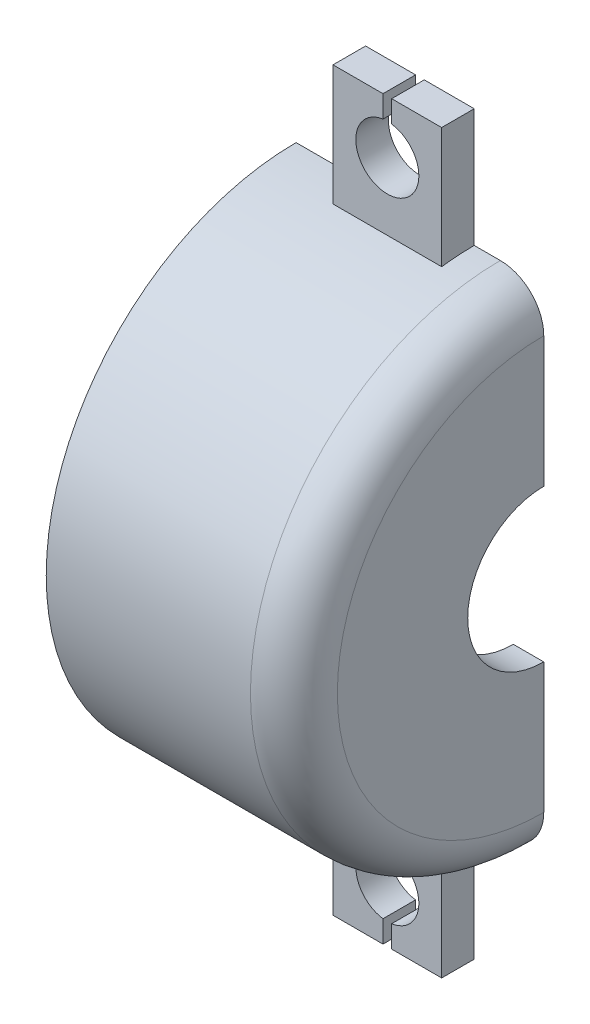
ISO-10303-21;
HEADER;
FILE_DESCRIPTION(('STEP AP214'),'2;1');
FILE_NAME('part.step','',(''),(''),'','','');
FILE_SCHEMA(('AUTOMOTIVE_DESIGN { 1 0 10303 214 1 1 1 1 }'));
ENDSEC;
DATA;
#1=APPLICATION_CONTEXT('core data for automotive mechanical design processes');
#2=APPLICATION_PROTOCOL_DEFINITION('international standard','automotive_design',2000,#1);
#3=PRODUCT_CONTEXT('',#1,'mechanical');
#4=PRODUCT('Part','Part','',(#3));
#5=PRODUCT_RELATED_PRODUCT_CATEGORY('part','',(#4));
#6=PRODUCT_DEFINITION_FORMATION('','',#4);
#7=PRODUCT_DEFINITION_CONTEXT('part definition',#1,'design');
#8=PRODUCT_DEFINITION('design','',#6,#7);
#9=PRODUCT_DEFINITION_SHAPE('','',#8);
#10=(LENGTH_UNIT() NAMED_UNIT(*) SI_UNIT(.MILLI.,.METRE.));
#11=(NAMED_UNIT(*) PLANE_ANGLE_UNIT() SI_UNIT($,.RADIAN.));
#12=(NAMED_UNIT(*) SI_UNIT($,.STERADIAN.) SOLID_ANGLE_UNIT());
#13=UNCERTAINTY_MEASURE_WITH_UNIT(LENGTH_MEASURE(1.E-05),#10,'distance_accuracy_value','');
#14=(GEOMETRIC_REPRESENTATION_CONTEXT(3) GLOBAL_UNCERTAINTY_ASSIGNED_CONTEXT((#13)) GLOBAL_UNIT_ASSIGNED_CONTEXT((#10,
#11,#12)) REPRESENTATION_CONTEXT('',''));
#15=CARTESIAN_POINT('',(0.,0.,0.));
#16=DIRECTION('',(0.,0.,1.));
#17=DIRECTION('',(1.,0.,0.));
#18=AXIS2_PLACEMENT_3D('',#15,#16,#17);
#19=CARTESIAN_POINT('',(-19.1835123598581,2.5,0.));
#20=DIRECTION('',(-1.,0.,0.));
#21=DIRECTION('',(0.,-1.,0.));
#22=AXIS2_PLACEMENT_3D('',#19,#20,#21);
#23=CYLINDRICAL_SURFACE('',#22,3.5);
#24=CARTESIAN_POINT('',(-13.,2.5,0.));
#25=DIRECTION('',(-1.,0.,0.));
#26=DIRECTION('',(0.,-1.,0.));
#27=AXIS2_PLACEMENT_3D('',#24,#25,#26);
#28=CIRCLE('',#27,3.5);
#29=CARTESIAN_POINT('',(-13.,-0.999999999999998,0.));
#30=VERTEX_POINT('',#29);
#31=CARTESIAN_POINT('',(-13.,6.,0.));
#32=VERTEX_POINT('',#31);
#33=EDGE_CURVE('E388',#30,#32,#28,.T.);
#34=ORIENTED_EDGE('',*,*,#33,.T.);
#35=DIRECTION('',(-1.,0.,0.));
#36=VECTOR('',#35,1.);
#37=CARTESIAN_POINT('',(-19.1835123598581,6.,0.));
#38=LINE('',#37,#36);
#39=CARTESIAN_POINT('',(-11.6,6.,0.));
#40=VERTEX_POINT('',#39);
#41=EDGE_CURVE('E385',#32,#40,#38,.F.);
#42=ORIENTED_EDGE('',*,*,#41,.T.);
#43=CARTESIAN_POINT('',(-11.6,2.5,0.));
#44=DIRECTION('',(-1.,0.,0.));
#45=DIRECTION('',(0.,-1.,0.));
#46=AXIS2_PLACEMENT_3D('',#43,#44,#45);
#47=CIRCLE('',#46,3.5);
#48=CARTESIAN_POINT('',(-11.6,-0.999999999999998,0.));
#49=VERTEX_POINT('',#48);
#50=EDGE_CURVE('E412',#49,#40,#47,.T.);
#51=ORIENTED_EDGE('',*,*,#50,.F.);
#52=DIRECTION('',(-1.,0.,0.));
#53=VECTOR('',#52,1.);
#54=CARTESIAN_POINT('',(-19.1835123598581,-0.999999999999998,0.));
#55=LINE('',#54,#53);
#56=EDGE_CURVE('E369',#49,#30,#55,.T.);
#57=ORIENTED_EDGE('',*,*,#56,.T.);
#58=EDGE_LOOP('',(#34,#42,#51,#57));
#59=FACE_BOUND('',#58,.T.);
#60=ADVANCED_FACE('F35',(#59),#23,.F.);
#61=CARTESIAN_POINT('',(-11.6,6.,0.));
#62=DIRECTION('',(-1.,0.,0.));
#63=DIRECTION('',(0.,-1.,0.));
#64=AXIS2_PLACEMENT_3D('',#61,#62,#63);
#65=PLANE('',#64);
#66=DIRECTION('',(0.,1.,0.));
#67=VECTOR('',#66,1.);
#68=CARTESIAN_POINT('',(-11.6,6.,0.));
#69=LINE('',#68,#67);
#70=CARTESIAN_POINT('',(-11.6,12.,0.));
#71=VERTEX_POINT('',#70);
#72=EDGE_CURVE('E370',#40,#71,#69,.T.);
#73=ORIENTED_EDGE('',*,*,#72,.T.);
#74=CARTESIAN_POINT('',(-11.6,2.5,0.));
#75=DIRECTION('',(-1.,0.,0.));
#76=DIRECTION('',(0.,-1.,0.));
#77=AXIS2_PLACEMENT_3D('',#74,#75,#76);
#78=CIRCLE('',#77,9.5);
#79=CARTESIAN_POINT('',(-11.6,-7.,0.));
#80=VERTEX_POINT('',#79);
#81=EDGE_CURVE('E43',#71,#80,#78,.F.);
#82=ORIENTED_EDGE('',*,*,#81,.T.);
#83=EDGE_CURVE('E367',#80,#49,#69,.T.);
#84=ORIENTED_EDGE('',*,*,#83,.T.);
#85=ORIENTED_EDGE('',*,*,#50,.T.);
#86=EDGE_LOOP('',(#73,#82,#84,#85));
#87=FACE_BOUND('',#86,.T.);
#88=ADVANCED_FACE('F498',(#87),#65,.F.);
#89=CARTESIAN_POINT('',(-19.1835123598581,2.5,0.));
#90=DIRECTION('',(-1.,0.,0.));
#91=DIRECTION('',(0.,-1.,0.));
#92=AXIS2_PLACEMENT_3D('',#89,#90,#91);
#93=CYLINDRICAL_SURFACE('',#92,11.5);
#94=DIRECTION('',(-1.,0.,0.));
#95=VECTOR('',#94,1.);
#96=CARTESIAN_POINT('',(-19.1835123598581,-9.,0.));
#97=LINE('',#96,#95);
#98=CARTESIAN_POINT('',(-14.8,-9.,0.));
#99=VERTEX_POINT('',#98);
#100=CARTESIAN_POINT('',(-13.6,-9.,0.));
#101=VERTEX_POINT('',#100);
#102=EDGE_CURVE('E363',#99,#101,#97,.F.);
#103=ORIENTED_EDGE('',*,*,#102,.T.);
#104=CARTESIAN_POINT('',(-13.6,2.5,0.));
#105=DIRECTION('',(-1.,0.,0.));
#106=DIRECTION('',(0.,-1.,0.));
#107=AXIS2_PLACEMENT_3D('',#104,#105,#106);
#108=CIRCLE('',#107,11.5);
#109=CARTESIAN_POINT('',(-13.6,14.,0.));
#110=VERTEX_POINT('',#109);
#111=EDGE_CURVE('E424',#101,#110,#108,.T.);
#112=ORIENTED_EDGE('',*,*,#111,.T.);
#113=DIRECTION('',(-1.,0.,0.));
#114=VECTOR('',#113,1.);
#115=CARTESIAN_POINT('',(-19.1835123598581,14.,0.));
#116=LINE('',#115,#114);
#117=CARTESIAN_POINT('',(-14.8,14.,0.));
#118=VERTEX_POINT('',#117);
#119=EDGE_CURVE('E382',#110,#118,#116,.T.);
#120=ORIENTED_EDGE('',*,*,#119,.T.);
#121=CARTESIAN_POINT('',(-14.8,2.5,0.));
#122=DIRECTION('',(1.,0.,0.));
#123=DIRECTION('',(0.,0.,-1.));
#124=AXIS2_PLACEMENT_3D('',#121,#122,#123);
#125=CIRCLE('',#124,11.5);
#126=CARTESIAN_POINT('',(-14.8,13.9017542509914,1.5));
#127=VERTEX_POINT('',#126);
#128=EDGE_CURVE('E328',#118,#127,#125,.T.);
#129=ORIENTED_EDGE('',*,*,#128,.T.);
#130=DIRECTION('',(-1.,0.,0.));
#131=VECTOR('',#130,1.);
#132=CARTESIAN_POINT('',(-19.1835123598581,13.9017542509914,1.5));
#133=LINE('',#132,#131);
#134=CARTESIAN_POINT('',(-19.8,13.9017542509914,1.5));
#135=VERTEX_POINT('',#134);
#136=EDGE_CURVE('E419',#135,#127,#133,.F.);
#137=ORIENTED_EDGE('',*,*,#136,.F.);
#138=CARTESIAN_POINT('',(-19.8,2.5,0.));
#139=DIRECTION('',(-1.,0.,0.));
#140=DIRECTION('',(0.,0.,1.));
#141=AXIS2_PLACEMENT_3D('',#138,#139,#140);
#142=CIRCLE('',#141,11.5);
#143=CARTESIAN_POINT('',(-19.8,14.,0.));
#144=VERTEX_POINT('',#143);
#145=EDGE_CURVE('E340',#135,#144,#142,.T.);
#146=ORIENTED_EDGE('',*,*,#145,.T.);
#147=CARTESIAN_POINT('',(-23.,14.,0.));
#148=VERTEX_POINT('',#147);
#149=EDGE_CURVE('E384',#144,#148,#116,.T.);
#150=ORIENTED_EDGE('',*,*,#149,.T.);
#151=CARTESIAN_POINT('',(-23.,2.5,0.));
#152=DIRECTION('',(-1.,0.,0.));
#153=DIRECTION('',(0.,-1.,0.));
#154=AXIS2_PLACEMENT_3D('',#151,#152,#153);
#155=CIRCLE('',#154,11.5);
#156=CARTESIAN_POINT('',(-23.,-8.99999999999999,0.));
#157=VERTEX_POINT('',#156);
#158=EDGE_CURVE('E409',#157,#148,#155,.T.);
#159=ORIENTED_EDGE('',*,*,#158,.F.);
#160=CARTESIAN_POINT('',(-19.8,-9.,0.));
#161=VERTEX_POINT('',#160);
#162=EDGE_CURVE('E365',#157,#161,#97,.F.);
#163=ORIENTED_EDGE('',*,*,#162,.T.);
#164=CARTESIAN_POINT('',(-19.8,2.5,0.));
#165=DIRECTION('',(-1.,0.,0.));
#166=DIRECTION('',(0.,0.,1.));
#167=AXIS2_PLACEMENT_3D('',#164,#165,#166);
#168=CIRCLE('',#167,11.5);
#169=CARTESIAN_POINT('',(-19.8,-8.90175425099138,1.5));
#170=VERTEX_POINT('',#169);
#171=EDGE_CURVE('E274',#161,#170,#168,.T.);
#172=ORIENTED_EDGE('',*,*,#171,.T.);
#173=DIRECTION('',(-1.,0.,0.));
#174=VECTOR('',#173,1.);
#175=CARTESIAN_POINT('',(-19.1835123598581,-8.90175425099138,1.5));
#176=LINE('',#175,#174);
#177=CARTESIAN_POINT('',(-14.8,-8.90175425099138,1.5));
#178=VERTEX_POINT('',#177);
#179=EDGE_CURVE('E422',#170,#178,#176,.F.);
#180=ORIENTED_EDGE('',*,*,#179,.T.);
#181=CARTESIAN_POINT('',(-14.8,2.5,0.));
#182=DIRECTION('',(1.,0.,0.));
#183=DIRECTION('',(0.,0.,-1.));
#184=AXIS2_PLACEMENT_3D('',#181,#182,#183);
#185=CIRCLE('',#184,11.5);
#186=EDGE_CURVE('E220',#178,#99,#185,.T.);
#187=ORIENTED_EDGE('',*,*,#186,.T.);
#188=EDGE_LOOP('',(#103,#112,#120,#129,#137,#146,#150,#159,#163,#172,#180,#187));
#189=FACE_BOUND('',#188,.T.);
#190=ADVANCED_FACE('F430',(#189),#93,.T.);
#191=CARTESIAN_POINT('',(-23.,12.,0.));
#192=DIRECTION('',(1.,0.,0.));
#193=DIRECTION('',(0.,1.,0.));
#194=AXIS2_PLACEMENT_3D('',#191,#192,#193);
#195=PLANE('',#194);
#196=ORIENTED_EDGE('',*,*,#158,.T.);
#197=DIRECTION('',(0.,-1.,0.));
#198=VECTOR('',#197,1.);
#199=CARTESIAN_POINT('',(-23.,12.,0.));
#200=LINE('',#199,#198);
#201=CARTESIAN_POINT('',(-23.,12.,0.));
#202=VERTEX_POINT('',#201);
#203=EDGE_CURVE('E364',#148,#202,#200,.T.);
#204=ORIENTED_EDGE('',*,*,#203,.T.);
#205=CARTESIAN_POINT('',(-23.,2.5,0.));
#206=DIRECTION('',(-1.,0.,0.));
#207=DIRECTION('',(0.,-1.,0.));
#208=AXIS2_PLACEMENT_3D('',#205,#206,#207);
#209=CIRCLE('',#208,9.5);
#210=CARTESIAN_POINT('',(-23.,-6.99999999999999,0.));
#211=VERTEX_POINT('',#210);
#212=EDGE_CURVE('E406',#211,#202,#209,.T.);
#213=ORIENTED_EDGE('',*,*,#212,.F.);
#214=EDGE_CURVE('E360',#211,#157,#200,.T.);
#215=ORIENTED_EDGE('',*,*,#214,.T.);
#216=EDGE_LOOP('',(#196,#204,#213,#215));
#217=FACE_BOUND('',#216,.T.);
#218=ADVANCED_FACE('F471',(#217),#195,.F.);
#219=CARTESIAN_POINT('',(-23.,2.5,0.));
#220=DIRECTION('',(1.,0.,0.));
#221=DIRECTION('',(0.,1.,0.));
#222=AXIS2_PLACEMENT_3D('',#219,#220,#221);
#223=CONICAL_SURFACE('',#222,9.5,0.321750554396642);
#224=CARTESIAN_POINT('',(-20.,2.5,0.));
#225=DIRECTION('',(-1.,0.,0.));
#226=DIRECTION('',(0.,-1.,0.));
#227=AXIS2_PLACEMENT_3D('',#224,#225,#226);
#228=CIRCLE('',#227,10.5);
#229=CARTESIAN_POINT('',(-20.,-7.99999999999999,0.));
#230=VERTEX_POINT('',#229);
#231=CARTESIAN_POINT('',(-20.,13.,0.));
#232=VERTEX_POINT('',#231);
#233=EDGE_CURVE('E403',#230,#232,#228,.T.);
#234=ORIENTED_EDGE('',*,*,#233,.F.);
#235=DIRECTION('',(0.948683298050514,-0.316227766016838,0.));
#236=VECTOR('',#235,1.);
#237=CARTESIAN_POINT('',(-51.5,2.5,0.));
#238=LINE('',#237,#236);
#239=EDGE_CURVE('E356',#230,#211,#238,.F.);
#240=ORIENTED_EDGE('',*,*,#239,.T.);
#241=ORIENTED_EDGE('',*,*,#212,.T.);
#242=DIRECTION('',(-0.948683298050514,-0.316227766016838,0.));
#243=VECTOR('',#242,1.);
#244=CARTESIAN_POINT('',(-51.5,2.5,0.));
#245=LINE('',#244,#243);
#246=EDGE_CURVE('E379',#202,#232,#245,.F.);
#247=ORIENTED_EDGE('',*,*,#246,.T.);
#248=EDGE_LOOP('',(#234,#240,#241,#247));
#249=FACE_BOUND('',#248,.T.);
#250=ADVANCED_FACE('F476',(#249),#223,.F.);
#251=CARTESIAN_POINT('',(-20.,11.,0.));
#252=DIRECTION('',(1.,0.,0.));
#253=DIRECTION('',(0.,1.,0.));
#254=AXIS2_PLACEMENT_3D('',#251,#252,#253);
#255=PLANE('',#254);
#256=ORIENTED_EDGE('',*,*,#233,.T.);
#257=DIRECTION('',(0.,-1.,0.));
#258=VECTOR('',#257,1.);
#259=CARTESIAN_POINT('',(-20.,11.,0.));
#260=LINE('',#259,#258);
#261=CARTESIAN_POINT('',(-20.,11.,0.));
#262=VERTEX_POINT('',#261);
#263=EDGE_CURVE('E357',#232,#262,#260,.T.);
#264=ORIENTED_EDGE('',*,*,#263,.T.);
#265=CARTESIAN_POINT('',(-20.,2.5,0.));
#266=DIRECTION('',(-1.,0.,0.));
#267=DIRECTION('',(0.,-1.,0.));
#268=AXIS2_PLACEMENT_3D('',#265,#266,#267);
#269=CIRCLE('',#268,8.5);
#270=CARTESIAN_POINT('',(-20.,-6.,0.));
#271=VERTEX_POINT('',#270);
#272=EDGE_CURVE('E400',#271,#262,#269,.T.);
#273=ORIENTED_EDGE('',*,*,#272,.F.);
#274=EDGE_CURVE('E353',#271,#230,#260,.T.);
#275=ORIENTED_EDGE('',*,*,#274,.T.);
#276=EDGE_LOOP('',(#256,#264,#273,#275));
#277=FACE_BOUND('',#276,.T.);
#278=ADVANCED_FACE('F479',(#277),#255,.F.);
#279=CARTESIAN_POINT('',(-19.1835123598581,2.5,0.));
#280=DIRECTION('',(-1.,0.,0.));
#281=DIRECTION('',(0.,-1.,0.));
#282=AXIS2_PLACEMENT_3D('',#279,#280,#281);
#283=CYLINDRICAL_SURFACE('',#282,8.5);
#284=ORIENTED_EDGE('',*,*,#272,.T.);
#285=DIRECTION('',(-1.,0.,0.));
#286=VECTOR('',#285,1.);
#287=CARTESIAN_POINT('',(-19.1835123598581,11.,0.));
#288=LINE('',#287,#286);
#289=CARTESIAN_POINT('',(-17.,11.,0.));
#290=VERTEX_POINT('',#289);
#291=EDGE_CURVE('E376',#262,#290,#288,.F.);
#292=ORIENTED_EDGE('',*,*,#291,.T.);
#293=CARTESIAN_POINT('',(-17.,2.5,0.));
#294=DIRECTION('',(-1.,0.,0.));
#295=DIRECTION('',(0.,-1.,0.));
#296=AXIS2_PLACEMENT_3D('',#293,#294,#295);
#297=CIRCLE('',#296,8.5);
#298=CARTESIAN_POINT('',(-17.,-6.,0.));
#299=VERTEX_POINT('',#298);
#300=EDGE_CURVE('E397',#299,#290,#297,.T.);
#301=ORIENTED_EDGE('',*,*,#300,.F.);
#302=DIRECTION('',(-1.,0.,0.));
#303=VECTOR('',#302,1.);
#304=CARTESIAN_POINT('',(-19.1835123598581,-6.,0.));
#305=LINE('',#304,#303);
#306=EDGE_CURVE('E349',#299,#271,#305,.T.);
#307=ORIENTED_EDGE('',*,*,#306,.T.);
#308=EDGE_LOOP('',(#284,#292,#301,#307));
#309=FACE_BOUND('',#308,.T.);
#310=ADVANCED_FACE('F483',(#309),#283,.F.);
#311=CARTESIAN_POINT('',(-17.,7.4,0.));
#312=DIRECTION('',(1.,0.,0.));
#313=DIRECTION('',(0.,1.,0.));
#314=AXIS2_PLACEMENT_3D('',#311,#312,#313);
#315=PLANE('',#314);
#316=ORIENTED_EDGE('',*,*,#300,.T.);
#317=DIRECTION('',(0.,-1.,0.));
#318=VECTOR('',#317,1.);
#319=CARTESIAN_POINT('',(-17.,7.4,0.));
#320=LINE('',#319,#318);
#321=CARTESIAN_POINT('',(-17.,7.4,0.));
#322=VERTEX_POINT('',#321);
#323=EDGE_CURVE('E350',#290,#322,#320,.T.);
#324=ORIENTED_EDGE('',*,*,#323,.T.);
#325=CARTESIAN_POINT('',(-17.,2.5,0.));
#326=DIRECTION('',(-1.,0.,0.));
#327=DIRECTION('',(0.,-1.,0.));
#328=AXIS2_PLACEMENT_3D('',#325,#326,#327);
#329=CIRCLE('',#328,4.9);
#330=CARTESIAN_POINT('',(-17.,-2.4,0.));
#331=VERTEX_POINT('',#330);
#332=EDGE_CURVE('E394',#331,#322,#329,.T.);
#333=ORIENTED_EDGE('',*,*,#332,.F.);
#334=EDGE_CURVE('E346',#331,#299,#320,.T.);
#335=ORIENTED_EDGE('',*,*,#334,.T.);
#336=EDGE_LOOP('',(#316,#324,#333,#335));
#337=FACE_BOUND('',#336,.T.);
#338=ADVANCED_FACE('F486',(#337),#315,.F.);
#339=CARTESIAN_POINT('',(-19.1835123598581,2.5,0.));
#340=DIRECTION('',(-1.,0.,0.));
#341=DIRECTION('',(0.,-1.,0.));
#342=AXIS2_PLACEMENT_3D('',#339,#340,#341);
#343=CYLINDRICAL_SURFACE('',#342,4.9);
#344=ORIENTED_EDGE('',*,*,#332,.T.);
#345=DIRECTION('',(-1.,0.,0.));
#346=VECTOR('',#345,1.);
#347=CARTESIAN_POINT('',(-19.1835123598581,7.4,0.));
#348=LINE('',#347,#346);
#349=CARTESIAN_POINT('',(-13.,7.4,0.));
#350=VERTEX_POINT('',#349);
#351=EDGE_CURVE('E373',#322,#350,#348,.F.);
#352=ORIENTED_EDGE('',*,*,#351,.T.);
#353=CARTESIAN_POINT('',(-13.,2.5,0.));
#354=DIRECTION('',(-1.,0.,0.));
#355=DIRECTION('',(0.,-1.,0.));
#356=AXIS2_PLACEMENT_3D('',#353,#354,#355);
#357=CIRCLE('',#356,4.9);
#358=CARTESIAN_POINT('',(-13.,-2.4,0.));
#359=VERTEX_POINT('',#358);
#360=EDGE_CURVE('E391',#359,#350,#357,.T.);
#361=ORIENTED_EDGE('',*,*,#360,.F.);
#362=DIRECTION('',(-1.,0.,0.));
#363=VECTOR('',#362,1.);
#364=CARTESIAN_POINT('',(-19.1835123598581,-2.4,0.));
#365=LINE('',#364,#363);
#366=EDGE_CURVE('E343',#359,#331,#365,.T.);
#367=ORIENTED_EDGE('',*,*,#366,.T.);
#368=EDGE_LOOP('',(#344,#352,#361,#367));
#369=FACE_BOUND('',#368,.T.);
#370=ADVANCED_FACE('F490',(#369),#343,.F.);
#371=CARTESIAN_POINT('',(-13.,6.,0.));
#372=DIRECTION('',(1.,0.,0.));
#373=DIRECTION('',(0.,1.,0.));
#374=AXIS2_PLACEMENT_3D('',#371,#372,#373);
#375=PLANE('',#374);
#376=ORIENTED_EDGE('',*,*,#360,.T.);
#377=DIRECTION('',(0.,-1.,0.));
#378=VECTOR('',#377,1.);
#379=CARTESIAN_POINT('',(-13.,6.,0.));
#380=LINE('',#379,#378);
#381=EDGE_CURVE('E418',#350,#32,#380,.T.);
#382=ORIENTED_EDGE('',*,*,#381,.T.);
#383=ORIENTED_EDGE('',*,*,#33,.F.);
#384=EDGE_CURVE('E415',#30,#359,#380,.T.);
#385=ORIENTED_EDGE('',*,*,#384,.T.);
#386=EDGE_LOOP('',(#376,#382,#383,#385));
#387=FACE_BOUND('',#386,.T.);
#388=ADVANCED_FACE('F493',(#387),#375,.F.);
#389=CARTESIAN_POINT('',(0.,0.,0.));
#390=DIRECTION('',(0.,0.,1.));
#391=DIRECTION('',(1.,0.,0.));
#392=AXIS2_PLACEMENT_3D('',#389,#390,#391);
#393=PLANE('',#392);
#394=ORIENTED_EDGE('',*,*,#83,.F.);
#395=CARTESIAN_POINT('',(-13.6,-7.,0.));
#396=DIRECTION('',(0.,0.,1.));
#397=DIRECTION('',(1.,0.,0.));
#398=AXIS2_PLACEMENT_3D('',#395,#396,#397);
#399=CIRCLE('',#398,2.);
#400=EDGE_CURVE('E11',#80,#101,#399,.F.);
#401=ORIENTED_EDGE('',*,*,#400,.T.);
#402=ORIENTED_EDGE('',*,*,#102,.F.);
#403=DIRECTION('',(0.,-1.,0.));
#404=VECTOR('',#403,1.);
#405=CARTESIAN_POINT('',(-14.8,-9.,0.));
#406=LINE('',#405,#404);
#407=CARTESIAN_POINT('',(-14.8,-14.45,0.));
#408=VERTEX_POINT('',#407);
#409=EDGE_CURVE('E225',#99,#408,#406,.T.);
#410=ORIENTED_EDGE('',*,*,#409,.T.);
#411=DIRECTION('',(-1.,0.,0.));
#412=VECTOR('',#411,1.);
#413=CARTESIAN_POINT('',(-14.8,-14.45,0.));
#414=LINE('',#413,#412);
#415=CARTESIAN_POINT('',(-17.1,-14.45,0.));
#416=VERTEX_POINT('',#415);
#417=EDGE_CURVE('E231',#408,#416,#414,.T.);
#418=ORIENTED_EDGE('',*,*,#417,.T.);
#419=DIRECTION('',(0.,1.,0.));
#420=VECTOR('',#419,1.);
#421=CARTESIAN_POINT('',(-17.1,-14.45,0.));
#422=LINE('',#421,#420);
#423=CARTESIAN_POINT('',(-17.1,-13.4361406616345,0.));
#424=VERTEX_POINT('',#423);
#425=EDGE_CURVE('E255',#416,#424,#422,.T.);
#426=ORIENTED_EDGE('',*,*,#425,.T.);
#427=CARTESIAN_POINT('',(-17.3,-12.,0.));
#428=DIRECTION('',(0.,0.,1.));
#429=DIRECTION('',(1.,0.,0.));
#430=AXIS2_PLACEMENT_3D('',#427,#428,#429);
#431=CIRCLE('',#430,1.45);
#432=CARTESIAN_POINT('',(-17.5,-13.4361406616345,0.));
#433=VERTEX_POINT('',#432);
#434=EDGE_CURVE('E258',#424,#433,#431,.T.);
#435=ORIENTED_EDGE('',*,*,#434,.T.);
#436=DIRECTION('',(0.,-1.,0.));
#437=VECTOR('',#436,1.);
#438=CARTESIAN_POINT('',(-17.5,-14.45,0.));
#439=LINE('',#438,#437);
#440=CARTESIAN_POINT('',(-17.5,-14.45,0.));
#441=VERTEX_POINT('',#440);
#442=EDGE_CURVE('E261',#433,#441,#439,.T.);
#443=ORIENTED_EDGE('',*,*,#442,.T.);
#444=DIRECTION('',(-1.,0.,0.));
#445=VECTOR('',#444,1.);
#446=CARTESIAN_POINT('',(-17.5,-14.45,0.));
#447=LINE('',#446,#445);
#448=CARTESIAN_POINT('',(-19.8,-14.45,0.));
#449=VERTEX_POINT('',#448);
#450=EDGE_CURVE('E264',#441,#449,#447,.T.);
#451=ORIENTED_EDGE('',*,*,#450,.T.);
#452=DIRECTION('',(0.,1.,0.));
#453=VECTOR('',#452,1.);
#454=CARTESIAN_POINT('',(-19.8,-9.,0.));
#455=LINE('',#454,#453);
#456=EDGE_CURVE('E267',#449,#161,#455,.T.);
#457=ORIENTED_EDGE('',*,*,#456,.T.);
#458=ORIENTED_EDGE('',*,*,#162,.F.);
#459=ORIENTED_EDGE('',*,*,#214,.F.);
#460=ORIENTED_EDGE('',*,*,#239,.F.);
#461=ORIENTED_EDGE('',*,*,#274,.F.);
#462=ORIENTED_EDGE('',*,*,#306,.F.);
#463=ORIENTED_EDGE('',*,*,#334,.F.);
#464=ORIENTED_EDGE('',*,*,#366,.F.);
#465=ORIENTED_EDGE('',*,*,#384,.F.);
#466=ORIENTED_EDGE('',*,*,#56,.F.);
#467=EDGE_LOOP('',(#394,#401,#402,#410,#418,#426,#435,#443,#451,#457,#458,#459,#460,#461,#462,
#463,#464,#465,#466));
#468=FACE_BOUND('',#467,.T.);
#469=ADVANCED_FACE('F473',(#468),#393,.F.);
#470=ORIENTED_EDGE('',*,*,#119,.F.);
#471=CARTESIAN_POINT('',(-13.6,12.,0.));
#472=DIRECTION('',(0.,0.,1.));
#473=DIRECTION('',(1.,0.,0.));
#474=AXIS2_PLACEMENT_3D('',#471,#472,#473);
#475=CIRCLE('',#474,2.);
#476=EDGE_CURVE('E57',#110,#71,#475,.F.);
#477=ORIENTED_EDGE('',*,*,#476,.T.);
#478=ORIENTED_EDGE('',*,*,#72,.F.);
#479=ORIENTED_EDGE('',*,*,#41,.F.);
#480=ORIENTED_EDGE('',*,*,#381,.F.);
#481=ORIENTED_EDGE('',*,*,#351,.F.);
#482=ORIENTED_EDGE('',*,*,#323,.F.);
#483=ORIENTED_EDGE('',*,*,#291,.F.);
#484=ORIENTED_EDGE('',*,*,#263,.F.);
#485=ORIENTED_EDGE('',*,*,#246,.F.);
#486=ORIENTED_EDGE('',*,*,#203,.F.);
#487=ORIENTED_EDGE('',*,*,#149,.F.);
#488=DIRECTION('',(0.,1.,0.));
#489=VECTOR('',#488,1.);
#490=CARTESIAN_POINT('',(-19.8,14.,0.));
#491=LINE('',#490,#489);
#492=CARTESIAN_POINT('',(-19.8,19.45,0.));
#493=VERTEX_POINT('',#492);
#494=EDGE_CURVE('E289',#144,#493,#491,.T.);
#495=ORIENTED_EDGE('',*,*,#494,.T.);
#496=DIRECTION('',(1.,0.,0.));
#497=VECTOR('',#496,1.);
#498=CARTESIAN_POINT('',(-17.5,19.45,0.));
#499=LINE('',#498,#497);
#500=CARTESIAN_POINT('',(-17.5,19.45,0.));
#501=VERTEX_POINT('',#500);
#502=EDGE_CURVE('E284',#493,#501,#499,.T.);
#503=ORIENTED_EDGE('',*,*,#502,.T.);
#504=DIRECTION('',(0.,-1.,0.));
#505=VECTOR('',#504,1.);
#506=CARTESIAN_POINT('',(-17.5,19.45,0.));
#507=LINE('',#506,#505);
#508=CARTESIAN_POINT('',(-17.5,18.4361406616345,0.));
#509=VERTEX_POINT('',#508);
#510=EDGE_CURVE('E309',#501,#509,#507,.T.);
#511=ORIENTED_EDGE('',*,*,#510,.T.);
#512=CARTESIAN_POINT('',(-17.3,17.,0.));
#513=DIRECTION('',(0.,0.,1.));
#514=DIRECTION('',(-1.,0.,0.));
#515=AXIS2_PLACEMENT_3D('',#512,#513,#514);
#516=CIRCLE('',#515,1.45);
#517=CARTESIAN_POINT('',(-17.1,18.4361406616345,0.));
#518=VERTEX_POINT('',#517);
#519=EDGE_CURVE('E312',#509,#518,#516,.T.);
#520=ORIENTED_EDGE('',*,*,#519,.T.);
#521=DIRECTION('',(0.,1.,0.));
#522=VECTOR('',#521,1.);
#523=CARTESIAN_POINT('',(-17.1,19.45,0.));
#524=LINE('',#523,#522);
#525=CARTESIAN_POINT('',(-17.1,19.45,0.));
#526=VERTEX_POINT('',#525);
#527=EDGE_CURVE('E315',#518,#526,#524,.T.);
#528=ORIENTED_EDGE('',*,*,#527,.T.);
#529=DIRECTION('',(1.,0.,0.));
#530=VECTOR('',#529,1.);
#531=CARTESIAN_POINT('',(-14.8,19.45,0.));
#532=LINE('',#531,#530);
#533=CARTESIAN_POINT('',(-14.8,19.45,0.));
#534=VERTEX_POINT('',#533);
#535=EDGE_CURVE('E318',#526,#534,#532,.T.);
#536=ORIENTED_EDGE('',*,*,#535,.T.);
#537=DIRECTION('',(0.,-1.,0.));
#538=VECTOR('',#537,1.);
#539=CARTESIAN_POINT('',(-14.8,14.,0.));
#540=LINE('',#539,#538);
#541=EDGE_CURVE('E321',#534,#118,#540,.T.);
#542=ORIENTED_EDGE('',*,*,#541,.T.);
#543=EDGE_LOOP('',(#470,#477,#478,#479,#480,#481,#482,#483,#484,#485,#486,#487,#495,#503,#511,
#520,#528,#536,#542));
#544=FACE_BOUND('',#543,.T.);
#545=ADVANCED_FACE('F434',(#544),#393,.F.);
#546=CARTESIAN_POINT('',(-17.3,17.,1.5));
#547=DIRECTION('',(0.,0.,-1.));
#548=DIRECTION('',(-1.,0.,0.));
#549=AXIS2_PLACEMENT_3D('',#546,#547,#548);
#550=PLANE('',#549);
#551=DIRECTION('',(0.,1.,0.));
#552=VECTOR('',#551,1.);
#553=CARTESIAN_POINT('',(-19.8,14.,1.5));
#554=LINE('',#553,#552);
#555=CARTESIAN_POINT('',(-19.8,19.45,1.5));
#556=VERTEX_POINT('',#555);
#557=EDGE_CURVE('E304',#135,#556,#554,.T.);
#558=ORIENTED_EDGE('',*,*,#557,.F.);
#559=ORIENTED_EDGE('',*,*,#136,.T.);
#560=DIRECTION('',(0.,-1.,0.));
#561=VECTOR('',#560,1.);
#562=CARTESIAN_POINT('',(-14.8,14.,1.5));
#563=LINE('',#562,#561);
#564=CARTESIAN_POINT('',(-14.8,19.45,1.5));
#565=VERTEX_POINT('',#564);
#566=EDGE_CURVE('E301',#565,#127,#563,.T.);
#567=ORIENTED_EDGE('',*,*,#566,.F.);
#568=DIRECTION('',(1.,0.,0.));
#569=VECTOR('',#568,1.);
#570=CARTESIAN_POINT('',(-14.8,19.45,1.5));
#571=LINE('',#570,#569);
#572=CARTESIAN_POINT('',(-17.1,19.45,1.5));
#573=VERTEX_POINT('',#572);
#574=EDGE_CURVE('E298',#573,#565,#571,.T.);
#575=ORIENTED_EDGE('',*,*,#574,.F.);
#576=DIRECTION('',(0.,1.,0.));
#577=VECTOR('',#576,1.);
#578=CARTESIAN_POINT('',(-17.1,19.45,1.5));
#579=LINE('',#578,#577);
#580=CARTESIAN_POINT('',(-17.1,18.4361406616345,1.5));
#581=VERTEX_POINT('',#580);
#582=EDGE_CURVE('E295',#581,#573,#579,.T.);
#583=ORIENTED_EDGE('',*,*,#582,.F.);
#584=CARTESIAN_POINT('',(-17.3,17.,1.5));
#585=DIRECTION('',(0.,0.,1.));
#586=DIRECTION('',(-1.,0.,0.));
#587=AXIS2_PLACEMENT_3D('',#584,#585,#586);
#588=CIRCLE('',#587,1.45);
#589=CARTESIAN_POINT('',(-17.5,18.4361406616345,1.5));
#590=VERTEX_POINT('',#589);
#591=EDGE_CURVE('E292',#590,#581,#588,.T.);
#592=ORIENTED_EDGE('',*,*,#591,.F.);
#593=DIRECTION('',(0.,-1.,0.));
#594=VECTOR('',#593,1.);
#595=CARTESIAN_POINT('',(-17.5,19.45,1.5));
#596=LINE('',#595,#594);
#597=CARTESIAN_POINT('',(-17.5,19.45,1.5));
#598=VERTEX_POINT('',#597);
#599=EDGE_CURVE('E288',#598,#590,#596,.T.);
#600=ORIENTED_EDGE('',*,*,#599,.F.);
#601=DIRECTION('',(1.,0.,0.));
#602=VECTOR('',#601,1.);
#603=CARTESIAN_POINT('',(-17.5,19.45,1.5));
#604=LINE('',#603,#602);
#605=EDGE_CURVE('E285',#556,#598,#604,.T.);
#606=ORIENTED_EDGE('',*,*,#605,.F.);
#607=EDGE_LOOP('',(#558,#559,#567,#575,#583,#592,#600,#606));
#608=FACE_BOUND('',#607,.T.);
#609=ADVANCED_FACE('F445',(#608),#550,.F.);
#610=CARTESIAN_POINT('',(-19.8,14.,1.5));
#611=DIRECTION('',(-1.,0.,0.));
#612=DIRECTION('',(0.,0.,1.));
#613=AXIS2_PLACEMENT_3D('',#610,#611,#612);
#614=PLANE('',#613);
#615=ORIENTED_EDGE('',*,*,#145,.F.);
#616=ORIENTED_EDGE('',*,*,#557,.T.);
#617=DIRECTION('',(0.,0.,-1.));
#618=VECTOR('',#617,1.);
#619=CARTESIAN_POINT('',(-19.8,19.45,1.5));
#620=LINE('',#619,#618);
#621=EDGE_CURVE('E325',#556,#493,#620,.T.);
#622=ORIENTED_EDGE('',*,*,#621,.T.);
#623=ORIENTED_EDGE('',*,*,#494,.F.);
#624=EDGE_LOOP('',(#615,#616,#622,#623));
#625=FACE_BOUND('',#624,.T.);
#626=ADVANCED_FACE('F464',(#625),#614,.T.);
#627=CARTESIAN_POINT('',(-14.8,14.,1.5));
#628=DIRECTION('',(1.,0.,0.));
#629=DIRECTION('',(0.,0.,-1.));
#630=AXIS2_PLACEMENT_3D('',#627,#628,#629);
#631=PLANE('',#630);
#632=ORIENTED_EDGE('',*,*,#128,.F.);
#633=ORIENTED_EDGE('',*,*,#541,.F.);
#634=DIRECTION('',(0.,0.,-1.));
#635=VECTOR('',#634,1.);
#636=CARTESIAN_POINT('',(-14.8,19.45,1.5));
#637=LINE('',#636,#635);
#638=EDGE_CURVE('E329',#565,#534,#637,.T.);
#639=ORIENTED_EDGE('',*,*,#638,.F.);
#640=ORIENTED_EDGE('',*,*,#566,.T.);
#641=EDGE_LOOP('',(#632,#633,#639,#640));
#642=FACE_BOUND('',#641,.T.);
#643=ADVANCED_FACE('F437',(#642),#631,.T.);
#644=CARTESIAN_POINT('',(-17.5,19.45,1.5));
#645=DIRECTION('',(0.,1.,0.));
#646=DIRECTION('',(0.,0.,1.));
#647=AXIS2_PLACEMENT_3D('',#644,#645,#646);
#648=PLANE('',#647);
#649=ORIENTED_EDGE('',*,*,#502,.F.);
#650=ORIENTED_EDGE('',*,*,#621,.F.);
#651=ORIENTED_EDGE('',*,*,#605,.T.);
#652=DIRECTION('',(0.,0.,-1.));
#653=VECTOR('',#652,1.);
#654=CARTESIAN_POINT('',(-17.5,19.45,1.5));
#655=LINE('',#654,#653);
#656=EDGE_CURVE('E306',#598,#501,#655,.T.);
#657=ORIENTED_EDGE('',*,*,#656,.T.);
#658=EDGE_LOOP('',(#649,#650,#651,#657));
#659=FACE_BOUND('',#658,.T.);
#660=ADVANCED_FACE('F460',(#659),#648,.T.);
#661=CARTESIAN_POINT('',(-14.8,19.45,1.5));
#662=DIRECTION('',(0.,1.,0.));
#663=DIRECTION('',(0.,0.,1.));
#664=AXIS2_PLACEMENT_3D('',#661,#662,#663);
#665=PLANE('',#664);
#666=ORIENTED_EDGE('',*,*,#535,.F.);
#667=DIRECTION('',(0.,0.,-1.));
#668=VECTOR('',#667,1.);
#669=CARTESIAN_POINT('',(-17.1,19.45,1.5));
#670=LINE('',#669,#668);
#671=EDGE_CURVE('E332',#573,#526,#670,.T.);
#672=ORIENTED_EDGE('',*,*,#671,.F.);
#673=ORIENTED_EDGE('',*,*,#574,.T.);
#674=ORIENTED_EDGE('',*,*,#638,.T.);
#675=EDGE_LOOP('',(#666,#672,#673,#674));
#676=FACE_BOUND('',#675,.T.);
#677=ADVANCED_FACE('F440',(#676),#665,.T.);
#678=CARTESIAN_POINT('',(-17.1,19.45,1.5));
#679=DIRECTION('',(-1.,0.,0.));
#680=DIRECTION('',(0.,0.,1.));
#681=AXIS2_PLACEMENT_3D('',#678,#679,#680);
#682=PLANE('',#681);
#683=ORIENTED_EDGE('',*,*,#527,.F.);
#684=DIRECTION('',(0.,0.,-1.));
#685=VECTOR('',#684,1.);
#686=CARTESIAN_POINT('',(-17.1,18.4361406616345,1.5));
#687=LINE('',#686,#685);
#688=EDGE_CURVE('E334',#581,#518,#687,.T.);
#689=ORIENTED_EDGE('',*,*,#688,.F.);
#690=ORIENTED_EDGE('',*,*,#582,.T.);
#691=ORIENTED_EDGE('',*,*,#671,.T.);
#692=EDGE_LOOP('',(#683,#689,#690,#691));
#693=FACE_BOUND('',#692,.T.);
#694=ADVANCED_FACE('F449',(#693),#682,.T.);
#695=CARTESIAN_POINT('',(-17.3,17.,1.5));
#696=DIRECTION('',(0.,0.,-1.));
#697=DIRECTION('',(-1.,0.,0.));
#698=AXIS2_PLACEMENT_3D('',#695,#696,#697);
#699=CYLINDRICAL_SURFACE('',#698,1.45);
#700=ORIENTED_EDGE('',*,*,#519,.F.);
#701=DIRECTION('',(0.,0.,-1.));
#702=VECTOR('',#701,1.);
#703=CARTESIAN_POINT('',(-17.5,18.4361406616345,1.5));
#704=LINE('',#703,#702);
#705=EDGE_CURVE('E336',#590,#509,#704,.T.);
#706=ORIENTED_EDGE('',*,*,#705,.F.);
#707=ORIENTED_EDGE('',*,*,#591,.T.);
#708=ORIENTED_EDGE('',*,*,#688,.T.);
#709=EDGE_LOOP('',(#700,#706,#707,#708));
#710=FACE_BOUND('',#709,.T.);
#711=ADVANCED_FACE('F452',(#710),#699,.F.);
#712=CARTESIAN_POINT('',(-17.5,19.45,1.5));
#713=DIRECTION('',(1.,0.,0.));
#714=DIRECTION('',(0.,0.,-1.));
#715=AXIS2_PLACEMENT_3D('',#712,#713,#714);
#716=PLANE('',#715);
#717=ORIENTED_EDGE('',*,*,#510,.F.);
#718=ORIENTED_EDGE('',*,*,#656,.F.);
#719=ORIENTED_EDGE('',*,*,#599,.T.);
#720=ORIENTED_EDGE('',*,*,#705,.T.);
#721=EDGE_LOOP('',(#717,#718,#719,#720));
#722=FACE_BOUND('',#721,.T.);
#723=ADVANCED_FACE('F457',(#722),#716,.T.);
#724=CARTESIAN_POINT('',(-17.3,-12.,1.5));
#725=DIRECTION('',(0.,0.,1.));
#726=DIRECTION('',(1.,0.,0.));
#727=AXIS2_PLACEMENT_3D('',#724,#725,#726);
#728=PLANE('',#727);
#729=ORIENTED_EDGE('',*,*,#179,.F.);
#730=DIRECTION('',(0.,1.,0.));
#731=VECTOR('',#730,1.);
#732=CARTESIAN_POINT('',(-19.8,-9.,1.5));
#733=LINE('',#732,#731);
#734=CARTESIAN_POINT('',(-19.8,-14.45,1.5));
#735=VERTEX_POINT('',#734);
#736=EDGE_CURVE('E233',#735,#170,#733,.T.);
#737=ORIENTED_EDGE('',*,*,#736,.F.);
#738=DIRECTION('',(-1.,0.,0.));
#739=VECTOR('',#738,1.);
#740=CARTESIAN_POINT('',(-17.5,-14.45,1.5));
#741=LINE('',#740,#739);
#742=CARTESIAN_POINT('',(-17.5,-14.45,1.5));
#743=VERTEX_POINT('',#742);
#744=EDGE_CURVE('E249',#743,#735,#741,.T.);
#745=ORIENTED_EDGE('',*,*,#744,.F.);
#746=DIRECTION('',(0.,-1.,0.));
#747=VECTOR('',#746,1.);
#748=CARTESIAN_POINT('',(-17.5,-14.45,1.5));
#749=LINE('',#748,#747);
#750=CARTESIAN_POINT('',(-17.5,-13.4361406616345,1.5));
#751=VERTEX_POINT('',#750);
#752=EDGE_CURVE('E246',#751,#743,#749,.T.);
#753=ORIENTED_EDGE('',*,*,#752,.F.);
#754=CARTESIAN_POINT('',(-17.3,-12.,1.5));
#755=DIRECTION('',(0.,0.,1.));
#756=DIRECTION('',(1.,0.,0.));
#757=AXIS2_PLACEMENT_3D('',#754,#755,#756);
#758=CIRCLE('',#757,1.45);
#759=CARTESIAN_POINT('',(-17.1,-13.4361406616345,1.5));
#760=VERTEX_POINT('',#759);
#761=EDGE_CURVE('E241',#760,#751,#758,.T.);
#762=ORIENTED_EDGE('',*,*,#761,.F.);
#763=DIRECTION('',(0.,1.,0.));
#764=VECTOR('',#763,1.);
#765=CARTESIAN_POINT('',(-17.1,-14.45,1.5));
#766=LINE('',#765,#764);
#767=CARTESIAN_POINT('',(-17.1,-14.45,1.5));
#768=VERTEX_POINT('',#767);
#769=EDGE_CURVE('E239',#768,#760,#766,.T.);
#770=ORIENTED_EDGE('',*,*,#769,.F.);
#771=DIRECTION('',(-1.,0.,0.));
#772=VECTOR('',#771,1.);
#773=CARTESIAN_POINT('',(-14.8,-14.45,1.5));
#774=LINE('',#773,#772);
#775=CARTESIAN_POINT('',(-14.8,-14.45,1.5));
#776=VERTEX_POINT('',#775);
#777=EDGE_CURVE('E224',#776,#768,#774,.T.);
#778=ORIENTED_EDGE('',*,*,#777,.F.);
#779=DIRECTION('',(0.,-1.,0.));
#780=VECTOR('',#779,1.);
#781=CARTESIAN_POINT('',(-14.8,-9.,1.5));
#782=LINE('',#781,#780);
#783=EDGE_CURVE('E213',#178,#776,#782,.T.);
#784=ORIENTED_EDGE('',*,*,#783,.F.);
#785=EDGE_LOOP('',(#729,#737,#745,#753,#762,#770,#778,#784));
#786=FACE_BOUND('',#785,.T.);
#787=ADVANCED_FACE('F236',(#786),#728,.T.);
#788=CARTESIAN_POINT('',(-14.8,-9.,1.5));
#789=DIRECTION('',(1.,0.,0.));
#790=DIRECTION('',(0.,0.,-1.));
#791=AXIS2_PLACEMENT_3D('',#788,#789,#790);
#792=PLANE('',#791);
#793=ORIENTED_EDGE('',*,*,#186,.F.);
#794=ORIENTED_EDGE('',*,*,#783,.T.);
#795=DIRECTION('',(0.,0.,-1.));
#796=VECTOR('',#795,1.);
#797=CARTESIAN_POINT('',(-14.8,-14.45,1.5));
#798=LINE('',#797,#796);
#799=EDGE_CURVE('E217',#776,#408,#798,.T.);
#800=ORIENTED_EDGE('',*,*,#799,.T.);
#801=ORIENTED_EDGE('',*,*,#409,.F.);
#802=EDGE_LOOP('',(#793,#794,#800,#801));
#803=FACE_BOUND('',#802,.T.);
#804=ADVANCED_FACE('F215',(#803),#792,.T.);
#805=CARTESIAN_POINT('',(-19.8,-9.,1.5));
#806=DIRECTION('',(-1.,0.,0.));
#807=DIRECTION('',(0.,0.,1.));
#808=AXIS2_PLACEMENT_3D('',#805,#806,#807);
#809=PLANE('',#808);
#810=ORIENTED_EDGE('',*,*,#171,.F.);
#811=ORIENTED_EDGE('',*,*,#456,.F.);
#812=DIRECTION('',(0.,0.,-1.));
#813=VECTOR('',#812,1.);
#814=CARTESIAN_POINT('',(-19.8,-14.45,1.5));
#815=LINE('',#814,#813);
#816=EDGE_CURVE('E271',#735,#449,#815,.T.);
#817=ORIENTED_EDGE('',*,*,#816,.F.);
#818=ORIENTED_EDGE('',*,*,#736,.T.);
#819=EDGE_LOOP('',(#810,#811,#817,#818));
#820=FACE_BOUND('',#819,.T.);
#821=ADVANCED_FACE('F559',(#820),#809,.T.);
#822=CARTESIAN_POINT('',(-17.5,-14.45,1.5));
#823=DIRECTION('',(0.,-1.,0.));
#824=DIRECTION('',(0.,0.,-1.));
#825=AXIS2_PLACEMENT_3D('',#822,#823,#824);
#826=PLANE('',#825);
#827=ORIENTED_EDGE('',*,*,#450,.F.);
#828=DIRECTION('',(0.,0.,-1.));
#829=VECTOR('',#828,1.);
#830=CARTESIAN_POINT('',(-17.5,-14.45,1.5));
#831=LINE('',#830,#829);
#832=EDGE_CURVE('E275',#743,#441,#831,.T.);
#833=ORIENTED_EDGE('',*,*,#832,.F.);
#834=ORIENTED_EDGE('',*,*,#744,.T.);
#835=ORIENTED_EDGE('',*,*,#816,.T.);
#836=EDGE_LOOP('',(#827,#833,#834,#835));
#837=FACE_BOUND('',#836,.T.);
#838=ADVANCED_FACE('F555',(#837),#826,.T.);
#839=CARTESIAN_POINT('',(-17.5,-14.45,1.5));
#840=DIRECTION('',(1.,0.,0.));
#841=DIRECTION('',(0.,0.,-1.));
#842=AXIS2_PLACEMENT_3D('',#839,#840,#841);
#843=PLANE('',#842);
#844=ORIENTED_EDGE('',*,*,#442,.F.);
#845=DIRECTION('',(0.,0.,-1.));
#846=VECTOR('',#845,1.);
#847=CARTESIAN_POINT('',(-17.5,-13.4361406616345,1.5));
#848=LINE('',#847,#846);
#849=EDGE_CURVE('E277',#751,#433,#848,.T.);
#850=ORIENTED_EDGE('',*,*,#849,.F.);
#851=ORIENTED_EDGE('',*,*,#752,.T.);
#852=ORIENTED_EDGE('',*,*,#832,.T.);
#853=EDGE_LOOP('',(#844,#850,#851,#852));
#854=FACE_BOUND('',#853,.T.);
#855=ADVANCED_FACE('F551',(#854),#843,.T.);
#856=CARTESIAN_POINT('',(-17.3,-12.,1.5));
#857=DIRECTION('',(0.,0.,-1.));
#858=DIRECTION('',(-1.,0.,0.));
#859=AXIS2_PLACEMENT_3D('',#856,#857,#858);
#860=CYLINDRICAL_SURFACE('',#859,1.45);
#861=ORIENTED_EDGE('',*,*,#434,.F.);
#862=DIRECTION('',(0.,0.,-1.));
#863=VECTOR('',#862,1.);
#864=CARTESIAN_POINT('',(-17.1,-13.4361406616345,1.5));
#865=LINE('',#864,#863);
#866=EDGE_CURVE('E279',#760,#424,#865,.T.);
#867=ORIENTED_EDGE('',*,*,#866,.F.);
#868=ORIENTED_EDGE('',*,*,#761,.T.);
#869=ORIENTED_EDGE('',*,*,#849,.T.);
#870=EDGE_LOOP('',(#861,#867,#868,#869));
#871=FACE_BOUND('',#870,.T.);
#872=ADVANCED_FACE('F547',(#871),#860,.F.);
#873=CARTESIAN_POINT('',(-17.1,-14.45,1.5));
#874=DIRECTION('',(-1.,0.,0.));
#875=DIRECTION('',(0.,0.,1.));
#876=AXIS2_PLACEMENT_3D('',#873,#874,#875);
#877=PLANE('',#876);
#878=ORIENTED_EDGE('',*,*,#425,.F.);
#879=DIRECTION('',(0.,0.,-1.));
#880=VECTOR('',#879,1.);
#881=CARTESIAN_POINT('',(-17.1,-14.45,1.5));
#882=LINE('',#881,#880);
#883=EDGE_CURVE('E232',#768,#416,#882,.T.);
#884=ORIENTED_EDGE('',*,*,#883,.F.);
#885=ORIENTED_EDGE('',*,*,#769,.T.);
#886=ORIENTED_EDGE('',*,*,#866,.T.);
#887=EDGE_LOOP('',(#878,#884,#885,#886));
#888=FACE_BOUND('',#887,.T.);
#889=ADVANCED_FACE('F503',(#888),#877,.T.);
#890=CARTESIAN_POINT('',(-14.8,-14.45,1.5));
#891=DIRECTION('',(0.,-1.,0.));
#892=DIRECTION('',(0.,0.,-1.));
#893=AXIS2_PLACEMENT_3D('',#890,#891,#892);
#894=PLANE('',#893);
#895=ORIENTED_EDGE('',*,*,#417,.F.);
#896=ORIENTED_EDGE('',*,*,#799,.F.);
#897=ORIENTED_EDGE('',*,*,#777,.T.);
#898=ORIENTED_EDGE('',*,*,#883,.T.);
#899=EDGE_LOOP('',(#895,#896,#897,#898));
#900=FACE_BOUND('',#899,.T.);
#901=ADVANCED_FACE('F229',(#900),#894,.T.);
#902=CARTESIAN_POINT('',(-13.6,2.5,0.));
#903=DIRECTION('',(-1.,0.,0.));
#904=DIRECTION('',(0.,-1.,0.));
#905=AXIS2_PLACEMENT_3D('',#902,#903,#904);
#906=TOROIDAL_SURFACE('',#905,9.5,2.);
#907=ORIENTED_EDGE('',*,*,#400,.F.);
#908=ORIENTED_EDGE('',*,*,#81,.F.);
#909=ORIENTED_EDGE('',*,*,#476,.F.);
#910=ORIENTED_EDGE('',*,*,#111,.F.);
#911=EDGE_LOOP('',(#907,#908,#909,#910));
#912=FACE_BOUND('',#911,.T.);
#913=ADVANCED_FACE('F37',(#912),#906,.T.);
#914=CLOSED_SHELL('',(#60,#88,#190,#218,#250,#278,#310,#338,#370,#388,#469,#545,#609,#626,#643,
#660,#677,#694,#711,#723,#787,#804,#821,#838,#855,#872,#889,#901,#913));
#915=MANIFOLD_SOLID_BREP('B2',#914);
#916=ADVANCED_BREP_SHAPE_REPRESENTATION('',(#18,#915),#14);
#917=SHAPE_DEFINITION_REPRESENTATION(#9,#916);
ENDSEC;
END-ISO-10303-21;
